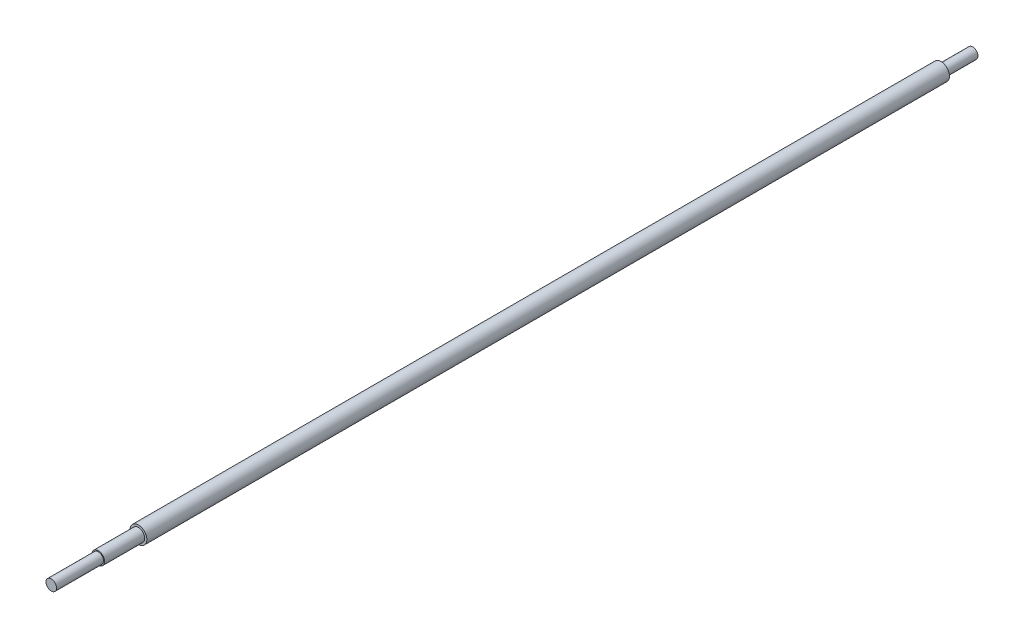
ISO-10303-21;
HEADER;
FILE_DESCRIPTION(('STEP AP214'),'2;1');
FILE_NAME('part.step','',(''),(''),'','','');
FILE_SCHEMA(('AUTOMOTIVE_DESIGN { 1 0 10303 214 1 1 1 1 }'));
ENDSEC;
DATA;
#1=APPLICATION_CONTEXT('core data for automotive mechanical design processes');
#2=APPLICATION_PROTOCOL_DEFINITION('international standard','automotive_design',2000,#1);
#3=PRODUCT_CONTEXT('',#1,'mechanical');
#4=PRODUCT('Part','Part','',(#3));
#5=PRODUCT_RELATED_PRODUCT_CATEGORY('part','',(#4));
#6=PRODUCT_DEFINITION_FORMATION('','',#4);
#7=PRODUCT_DEFINITION_CONTEXT('part definition',#1,'design');
#8=PRODUCT_DEFINITION('design','',#6,#7);
#9=PRODUCT_DEFINITION_SHAPE('','',#8);
#10=(LENGTH_UNIT() NAMED_UNIT(*) SI_UNIT(.MILLI.,.METRE.));
#11=(NAMED_UNIT(*) PLANE_ANGLE_UNIT() SI_UNIT($,.RADIAN.));
#12=(NAMED_UNIT(*) SI_UNIT($,.STERADIAN.) SOLID_ANGLE_UNIT());
#13=UNCERTAINTY_MEASURE_WITH_UNIT(LENGTH_MEASURE(1.E-05),#10,'distance_accuracy_value','');
#14=(GEOMETRIC_REPRESENTATION_CONTEXT(3) GLOBAL_UNCERTAINTY_ASSIGNED_CONTEXT((#13)) GLOBAL_UNIT_ASSIGNED_CONTEXT((#10,
#11,#12)) REPRESENTATION_CONTEXT('',''));
#15=CARTESIAN_POINT('',(0.,0.,0.));
#16=DIRECTION('',(0.,0.,1.));
#17=DIRECTION('',(1.,0.,0.));
#18=AXIS2_PLACEMENT_3D('',#15,#16,#17);
#19=CARTESIAN_POINT('',(8.0056,8.0056,872.5035));
#20=DIRECTION('',(0.,0.,1.));
#21=DIRECTION('',(1.,0.,0.));
#22=AXIS2_PLACEMENT_3D('',#19,#20,#21);
#23=PLANE('',#22);
#24=CARTESIAN_POINT('',(8.0056,8.0056,872.5035));
#25=DIRECTION('',(0.,0.,1.));
#26=DIRECTION('',(1.,0.,0.));
#27=AXIS2_PLACEMENT_3D('',#24,#25,#26);
#28=CIRCLE('',#27,5.);
#29=CARTESIAN_POINT('',(13.0056,8.0056,872.5035));
#30=VERTEX_POINT('',#29);
#31=EDGE_CURVE('E16',#30,#30,#28,.F.);
#32=ORIENTED_EDGE('',*,*,#31,.F.);
#33=EDGE_LOOP('',(#32));
#34=FACE_BOUND('',#33,.T.);
#35=ADVANCED_FACE('F13',(#34),#23,.T.);
#36=CARTESIAN_POINT('',(8.0056,8.0056,828.0035));
#37=DIRECTION('',(0.,0.,1.));
#38=DIRECTION('',(1.,0.,0.));
#39=AXIS2_PLACEMENT_3D('',#36,#37,#38);
#40=CYLINDRICAL_SURFACE('',#39,5.);
#41=CARTESIAN_POINT('',(8.0056,8.0056,828.0035));
#42=DIRECTION('',(0.,0.,1.));
#43=DIRECTION('',(1.,0.,0.));
#44=AXIS2_PLACEMENT_3D('',#41,#42,#43);
#45=CIRCLE('',#44,5.);
#46=CARTESIAN_POINT('',(13.0056,8.0056,828.0035));
#47=VERTEX_POINT('',#46);
#48=EDGE_CURVE('E38',#47,#47,#45,.F.);
#49=ORIENTED_EDGE('',*,*,#48,.F.);
#50=EDGE_LOOP('',(#49));
#51=FACE_BOUND('',#50,.T.);
#52=ORIENTED_EDGE('',*,*,#31,.T.);
#53=EDGE_LOOP('',(#52));
#54=FACE_BOUND('',#53,.T.);
#55=ADVANCED_FACE('F45',(#51,#54),#40,.T.);
#56=CARTESIAN_POINT('',(8.0056,8.0056,828.0035));
#57=DIRECTION('',(0.,0.,1.));
#58=DIRECTION('',(1.,0.,0.));
#59=AXIS2_PLACEMENT_3D('',#56,#57,#58);
#60=PLANE('',#59);
#61=ORIENTED_EDGE('',*,*,#48,.T.);
#62=EDGE_LOOP('',(#61));
#63=FACE_BOUND('',#62,.T.);
#64=CARTESIAN_POINT('',(8.0056,8.0056,828.0035));
#65=DIRECTION('',(0.,0.,1.));
#66=DIRECTION('',(1.,0.,0.));
#67=AXIS2_PLACEMENT_3D('',#64,#65,#66);
#68=CIRCLE('',#67,6.);
#69=CARTESIAN_POINT('',(14.0056,8.0056,828.0035));
#70=VERTEX_POINT('',#69);
#71=EDGE_CURVE('E36',#70,#70,#68,.F.);
#72=ORIENTED_EDGE('',*,*,#71,.F.);
#73=EDGE_LOOP('',(#72));
#74=FACE_BOUND('',#73,.T.);
#75=ADVANCED_FACE('F52',(#63,#74),#60,.T.);
#76=CARTESIAN_POINT('',(8.0056,8.0056,0.003500000000031));
#77=DIRECTION('',(0.,0.,1.));
#78=DIRECTION('',(1.,0.,0.));
#79=AXIS2_PLACEMENT_3D('',#76,#77,#78);
#80=PLANE('',#79);
#81=CARTESIAN_POINT('',(8.0056,8.0056,0.003500000000031));
#82=DIRECTION('',(0.,0.,1.));
#83=DIRECTION('',(1.,0.,0.));
#84=AXIS2_PLACEMENT_3D('',#81,#82,#83);
#85=CIRCLE('',#84,5.);
#86=CARTESIAN_POINT('',(13.0056,8.0056,0.003500000000031));
#87=VERTEX_POINT('',#86);
#88=EDGE_CURVE('E33',#87,#87,#85,.T.);
#89=ORIENTED_EDGE('',*,*,#88,.F.);
#90=EDGE_LOOP('',(#89));
#91=FACE_BOUND('',#90,.T.);
#92=ADVANCED_FACE('F76',(#91),#80,.F.);
#93=CARTESIAN_POINT('',(8.0056,8.0056,790.0035));
#94=DIRECTION('',(0.,0.,1.));
#95=DIRECTION('',(1.,0.,0.));
#96=AXIS2_PLACEMENT_3D('',#93,#94,#95);
#97=CYLINDRICAL_SURFACE('',#96,6.);
#98=CARTESIAN_POINT('',(8.0056,8.0056,790.0035));
#99=DIRECTION('',(0.,0.,1.));
#100=DIRECTION('',(1.,0.,0.));
#101=AXIS2_PLACEMENT_3D('',#98,#99,#100);
#102=CIRCLE('',#101,6.);
#103=CARTESIAN_POINT('',(14.0056,8.0056,790.0035));
#104=VERTEX_POINT('',#103);
#105=EDGE_CURVE('E30',#104,#104,#102,.F.);
#106=ORIENTED_EDGE('',*,*,#105,.F.);
#107=EDGE_LOOP('',(#106));
#108=FACE_BOUND('',#107,.T.);
#109=ORIENTED_EDGE('',*,*,#71,.T.);
#110=EDGE_LOOP('',(#109));
#111=FACE_BOUND('',#110,.T.);
#112=ADVANCED_FACE('F72',(#108,#111),#97,.T.);
#113=CARTESIAN_POINT('',(8.0056,8.0056,0.003500000000031));
#114=DIRECTION('',(0.,0.,1.));
#115=DIRECTION('',(1.,0.,0.));
#116=AXIS2_PLACEMENT_3D('',#113,#114,#115);
#117=CYLINDRICAL_SURFACE('',#116,5.);
#118=ORIENTED_EDGE('',*,*,#88,.T.);
#119=EDGE_LOOP('',(#118));
#120=FACE_BOUND('',#119,.T.);
#121=CARTESIAN_POINT('',(8.0056,8.0056,30.0035));
#122=DIRECTION('',(0.,0.,1.));
#123=DIRECTION('',(1.,0.,0.));
#124=AXIS2_PLACEMENT_3D('',#121,#122,#123);
#125=CIRCLE('',#124,5.);
#126=CARTESIAN_POINT('',(13.0056,8.0056,30.0035));
#127=VERTEX_POINT('',#126);
#128=EDGE_CURVE('E25',#127,#127,#125,.F.);
#129=ORIENTED_EDGE('',*,*,#128,.T.);
#130=EDGE_LOOP('',(#129));
#131=FACE_BOUND('',#130,.T.);
#132=ADVANCED_FACE('F68',(#120,#131),#117,.T.);
#133=CARTESIAN_POINT('',(8.0056,8.0056,790.0035));
#134=DIRECTION('',(0.,0.,1.));
#135=DIRECTION('',(1.,0.,0.));
#136=AXIS2_PLACEMENT_3D('',#133,#134,#135);
#137=PLANE('',#136);
#138=ORIENTED_EDGE('',*,*,#105,.T.);
#139=EDGE_LOOP('',(#138));
#140=FACE_BOUND('',#139,.T.);
#141=CARTESIAN_POINT('',(8.0056,8.0056,790.0035));
#142=DIRECTION('',(0.,0.,1.));
#143=DIRECTION('',(1.,0.,0.));
#144=AXIS2_PLACEMENT_3D('',#141,#142,#143);
#145=CIRCLE('',#144,8.);
#146=CARTESIAN_POINT('',(16.0056,8.0056,790.0035));
#147=VERTEX_POINT('',#146);
#148=EDGE_CURVE('E20',#147,#147,#145,.F.);
#149=ORIENTED_EDGE('',*,*,#148,.F.);
#150=EDGE_LOOP('',(#149));
#151=FACE_BOUND('',#150,.T.);
#152=ADVANCED_FACE('F61',(#140,#151),#137,.T.);
#153=CARTESIAN_POINT('',(8.0056,8.0056,30.0035));
#154=DIRECTION('',(0.,0.,1.));
#155=DIRECTION('',(1.,0.,0.));
#156=AXIS2_PLACEMENT_3D('',#153,#154,#155);
#157=PLANE('',#156);
#158=ORIENTED_EDGE('',*,*,#128,.F.);
#159=EDGE_LOOP('',(#158));
#160=FACE_BOUND('',#159,.T.);
#161=CARTESIAN_POINT('',(8.0056,8.0056,30.0035));
#162=DIRECTION('',(0.,0.,1.));
#163=DIRECTION('',(1.,0.,0.));
#164=AXIS2_PLACEMENT_3D('',#161,#162,#163);
#165=CIRCLE('',#164,8.);
#166=CARTESIAN_POINT('',(16.0056,8.0056,30.0035));
#167=VERTEX_POINT('',#166);
#168=EDGE_CURVE('E8',#167,#167,#165,.T.);
#169=ORIENTED_EDGE('',*,*,#168,.F.);
#170=EDGE_LOOP('',(#169));
#171=FACE_BOUND('',#170,.T.);
#172=ADVANCED_FACE('F56',(#160,#171),#157,.F.);
#173=CARTESIAN_POINT('',(8.0056,8.0056,30.0035));
#174=DIRECTION('',(0.,0.,1.));
#175=DIRECTION('',(1.,0.,0.));
#176=AXIS2_PLACEMENT_3D('',#173,#174,#175);
#177=CYLINDRICAL_SURFACE('',#176,8.);
#178=ORIENTED_EDGE('',*,*,#168,.T.);
#179=EDGE_LOOP('',(#178));
#180=FACE_BOUND('',#179,.T.);
#181=ORIENTED_EDGE('',*,*,#148,.T.);
#182=EDGE_LOOP('',(#181));
#183=FACE_BOUND('',#182,.T.);
#184=ADVANCED_FACE('F54',(#180,#183),#177,.T.);
#185=CLOSED_SHELL('',(#35,#55,#75,#92,#112,#132,#152,#172,#184));
#186=MANIFOLD_SOLID_BREP('B1',#185);
#187=ADVANCED_BREP_SHAPE_REPRESENTATION('',(#18,#186),#14);
#188=SHAPE_DEFINITION_REPRESENTATION(#9,#187);
ENDSEC;
END-ISO-10303-21;
